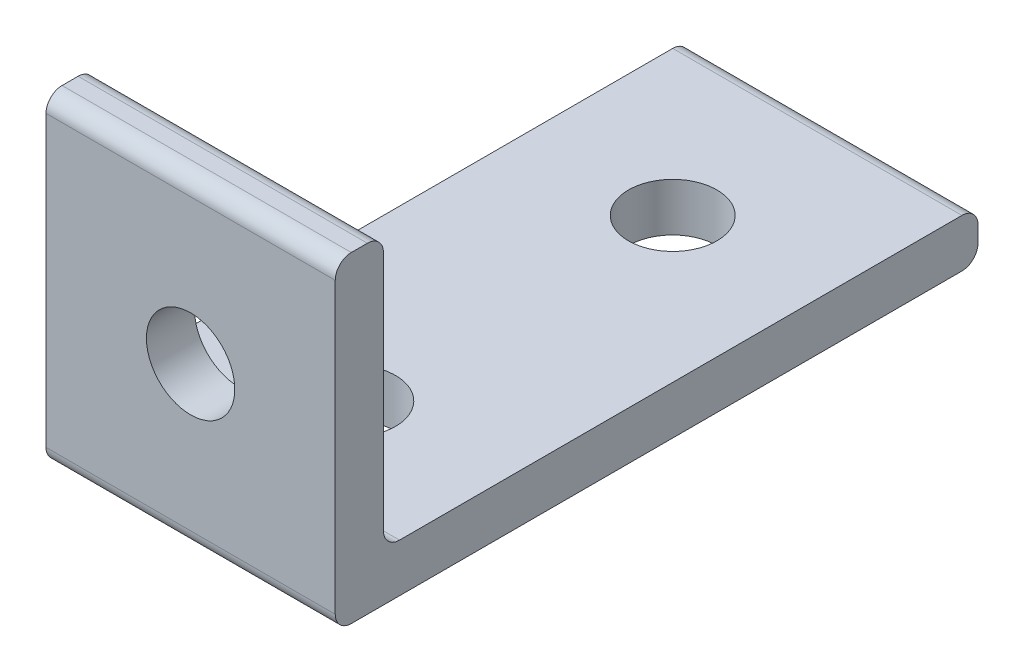
ISO-10303-21;
HEADER;
FILE_DESCRIPTION(('STEP AP214'),'2;1');
FILE_NAME('part.step','',(''),(''),'','','');
FILE_SCHEMA(('AUTOMOTIVE_DESIGN { 1 0 10303 214 1 1 1 1 }'));
ENDSEC;
DATA;
#1=APPLICATION_CONTEXT('core data for automotive mechanical design processes');
#2=APPLICATION_PROTOCOL_DEFINITION('international standard','automotive_design',2000,#1);
#3=PRODUCT_CONTEXT('',#1,'mechanical');
#4=PRODUCT('Part','Part','',(#3));
#5=PRODUCT_RELATED_PRODUCT_CATEGORY('part','',(#4));
#6=PRODUCT_DEFINITION_FORMATION('','',#4);
#7=PRODUCT_DEFINITION_CONTEXT('part definition',#1,'design');
#8=PRODUCT_DEFINITION('design','',#6,#7);
#9=PRODUCT_DEFINITION_SHAPE('','',#8);
#10=(LENGTH_UNIT() NAMED_UNIT(*) SI_UNIT(.MILLI.,.METRE.));
#11=(NAMED_UNIT(*) PLANE_ANGLE_UNIT() SI_UNIT($,.RADIAN.));
#12=(NAMED_UNIT(*) SI_UNIT($,.STERADIAN.) SOLID_ANGLE_UNIT());
#13=UNCERTAINTY_MEASURE_WITH_UNIT(LENGTH_MEASURE(1.E-05),#10,'distance_accuracy_value','');
#14=(GEOMETRIC_REPRESENTATION_CONTEXT(3) GLOBAL_UNCERTAINTY_ASSIGNED_CONTEXT((#13)) GLOBAL_UNIT_ASSIGNED_CONTEXT((#10,
#11,#12)) REPRESENTATION_CONTEXT('',''));
#15=CARTESIAN_POINT('',(0.,0.,0.));
#16=DIRECTION('',(0.,0.,1.));
#17=DIRECTION('',(1.,0.,0.));
#18=AXIS2_PLACEMENT_3D('',#15,#16,#17);
#19=CARTESIAN_POINT('',(18.,0.,0.));
#20=DIRECTION('',(0.,0.,-1.));
#21=DIRECTION('',(-1.,0.,0.));
#22=AXIS2_PLACEMENT_3D('',#19,#20,#21);
#23=PLANE('',#22);
#24=CARTESIAN_POINT('',(9.,10.,0.));
#25=DIRECTION('',(0.,0.,-1.));
#26=DIRECTION('',(-1.,0.,0.));
#27=AXIS2_PLACEMENT_3D('',#24,#25,#26);
#28=CIRCLE('',#27,2.75);
#29=CARTESIAN_POINT('',(6.25,10.,0.));
#30=VERTEX_POINT('',#29);
#31=EDGE_CURVE('E251',#30,#30,#28,.T.);
#32=ORIENTED_EDGE('',*,*,#31,.T.);
#33=EDGE_LOOP('',(#32));
#34=FACE_BOUND('',#33,.T.);
#35=DIRECTION('',(0.,-1.,0.));
#36=VECTOR('',#35,1.);
#37=CARTESIAN_POINT('',(0.,0.,0.));
#38=LINE('',#37,#36);
#39=CARTESIAN_POINT('',(0.,19.,0.));
#40=VERTEX_POINT('',#39);
#41=CARTESIAN_POINT('',(0.,1.,0.));
#42=VERTEX_POINT('',#41);
#43=EDGE_CURVE('E172',#40,#42,#38,.T.);
#44=ORIENTED_EDGE('',*,*,#43,.T.);
#45=DIRECTION('',(-1.,0.,0.));
#46=VECTOR('',#45,1.);
#47=CARTESIAN_POINT('',(18.,1.,0.));
#48=LINE('',#47,#46);
#49=CARTESIAN_POINT('',(18.,1.,0.));
#50=VERTEX_POINT('',#49);
#51=EDGE_CURVE('E58',#42,#50,#48,.F.);
#52=ORIENTED_EDGE('',*,*,#51,.T.);
#53=DIRECTION('',(0.,-1.,0.));
#54=VECTOR('',#53,1.);
#55=CARTESIAN_POINT('',(18.,0.,0.));
#56=LINE('',#55,#54);
#57=CARTESIAN_POINT('',(18.,19.,0.));
#58=VERTEX_POINT('',#57);
#59=EDGE_CURVE('E170',#58,#50,#56,.T.);
#60=ORIENTED_EDGE('',*,*,#59,.F.);
#61=DIRECTION('',(-1.,0.,0.));
#62=VECTOR('',#61,1.);
#63=CARTESIAN_POINT('',(18.,19.,0.));
#64=LINE('',#63,#62);
#65=EDGE_CURVE('E215',#58,#40,#64,.T.);
#66=ORIENTED_EDGE('',*,*,#65,.T.);
#67=EDGE_LOOP('',(#44,#52,#60,#66));
#68=FACE_BOUND('',#67,.T.);
#69=ADVANCED_FACE('F42',(#34,#68),#23,.F.);
#70=CARTESIAN_POINT('',(18.,0.,0.));
#71=DIRECTION('',(0.,1.,0.));
#72=DIRECTION('',(0.,0.,1.));
#73=AXIS2_PLACEMENT_3D('',#70,#71,#72);
#74=PLANE('',#73);
#75=CARTESIAN_POINT('',(9.,0.,-30.));
#76=DIRECTION('',(0.,1.,0.));
#77=DIRECTION('',(0.,0.,1.));
#78=AXIS2_PLACEMENT_3D('',#75,#76,#77);
#79=CIRCLE('',#78,2.75);
#80=CARTESIAN_POINT('',(9.,0.,-27.25));
#81=VERTEX_POINT('',#80);
#82=EDGE_CURVE('E347',#81,#81,#79,.T.);
#83=ORIENTED_EDGE('',*,*,#82,.T.);
#84=EDGE_LOOP('',(#83));
#85=FACE_BOUND('',#84,.T.);
#86=CARTESIAN_POINT('',(9.,0.,-10.));
#87=DIRECTION('',(0.,1.,0.));
#88=DIRECTION('',(0.,0.,1.));
#89=AXIS2_PLACEMENT_3D('',#86,#87,#88);
#90=CIRCLE('',#89,2.75);
#91=CARTESIAN_POINT('',(9.,0.,-7.25));
#92=VERTEX_POINT('',#91);
#93=EDGE_CURVE('E350',#92,#92,#90,.T.);
#94=ORIENTED_EDGE('',*,*,#93,.T.);
#95=EDGE_LOOP('',(#94));
#96=FACE_BOUND('',#95,.T.);
#97=DIRECTION('',(0.,0.,-1.));
#98=VECTOR('',#97,1.);
#99=CARTESIAN_POINT('',(0.,0.,0.));
#100=LINE('',#99,#98);
#101=CARTESIAN_POINT('',(0.,0.,-1.));
#102=VERTEX_POINT('',#101);
#103=CARTESIAN_POINT('',(0.,0.,-39.));
#104=VERTEX_POINT('',#103);
#105=EDGE_CURVE('E165',#102,#104,#100,.T.);
#106=ORIENTED_EDGE('',*,*,#105,.T.);
#107=DIRECTION('',(-1.,0.,0.));
#108=VECTOR('',#107,1.);
#109=CARTESIAN_POINT('',(18.,0.,-39.));
#110=LINE('',#109,#108);
#111=CARTESIAN_POINT('',(18.,0.,-39.));
#112=VERTEX_POINT('',#111);
#113=EDGE_CURVE('E138',#104,#112,#110,.F.);
#114=ORIENTED_EDGE('',*,*,#113,.T.);
#115=DIRECTION('',(0.,0.,-1.));
#116=VECTOR('',#115,1.);
#117=CARTESIAN_POINT('',(18.,0.,0.));
#118=LINE('',#117,#116);
#119=CARTESIAN_POINT('',(18.,0.,-1.));
#120=VERTEX_POINT('',#119);
#121=EDGE_CURVE('E271',#120,#112,#118,.T.);
#122=ORIENTED_EDGE('',*,*,#121,.F.);
#123=DIRECTION('',(-1.,0.,0.));
#124=VECTOR('',#123,1.);
#125=CARTESIAN_POINT('',(18.,0.,-1.));
#126=LINE('',#125,#124);
#127=EDGE_CURVE('E144',#120,#102,#126,.T.);
#128=ORIENTED_EDGE('',*,*,#127,.T.);
#129=EDGE_LOOP('',(#106,#114,#122,#128));
#130=FACE_BOUND('',#129,.T.);
#131=ADVANCED_FACE('F292',(#85,#96,#130),#74,.F.);
#132=CARTESIAN_POINT('',(18.,0.,-40.));
#133=DIRECTION('',(0.,0.,1.));
#134=DIRECTION('',(1.,0.,0.));
#135=AXIS2_PLACEMENT_3D('',#132,#133,#134);
#136=PLANE('',#135);
#137=DIRECTION('',(0.,1.,0.));
#138=VECTOR('',#137,1.);
#139=CARTESIAN_POINT('',(18.,0.,-40.));
#140=LINE('',#139,#138);
#141=CARTESIAN_POINT('',(18.,1.,-40.));
#142=VERTEX_POINT('',#141);
#143=CARTESIAN_POINT('',(18.,2.,-40.));
#144=VERTEX_POINT('',#143);
#145=EDGE_CURVE('E155',#142,#144,#140,.T.);
#146=ORIENTED_EDGE('',*,*,#145,.F.);
#147=DIRECTION('',(-1.,0.,0.));
#148=VECTOR('',#147,1.);
#149=CARTESIAN_POINT('',(18.,1.,-40.));
#150=LINE('',#149,#148);
#151=CARTESIAN_POINT('',(0.,1.,-40.));
#152=VERTEX_POINT('',#151);
#153=EDGE_CURVE('E137',#142,#152,#150,.T.);
#154=ORIENTED_EDGE('',*,*,#153,.T.);
#155=DIRECTION('',(0.,1.,0.));
#156=VECTOR('',#155,1.);
#157=CARTESIAN_POINT('',(0.,0.,-40.));
#158=LINE('',#157,#156);
#159=CARTESIAN_POINT('',(0.,2.,-40.));
#160=VERTEX_POINT('',#159);
#161=EDGE_CURVE('E152',#152,#160,#158,.T.);
#162=ORIENTED_EDGE('',*,*,#161,.T.);
#163=DIRECTION('',(1.,0.,0.));
#164=VECTOR('',#163,1.);
#165=CARTESIAN_POINT('',(18.,2.,-40.));
#166=LINE('',#165,#164);
#167=EDGE_CURVE('E158',#160,#144,#166,.T.);
#168=ORIENTED_EDGE('',*,*,#167,.T.);
#169=EDGE_LOOP('',(#146,#154,#162,#168));
#170=FACE_BOUND('',#169,.T.);
#171=ADVANCED_FACE('F150',(#170),#136,.F.);
#172=CARTESIAN_POINT('',(18.,20.,0.));
#173=DIRECTION('',(0.,-1.,0.));
#174=DIRECTION('',(0.,0.,-1.));
#175=AXIS2_PLACEMENT_3D('',#172,#173,#174);
#176=PLANE('',#175);
#177=DIRECTION('',(0.,0.,1.));
#178=VECTOR('',#177,1.);
#179=CARTESIAN_POINT('',(0.,20.,0.));
#180=LINE('',#179,#178);
#181=CARTESIAN_POINT('',(0.,20.,-2.));
#182=VERTEX_POINT('',#181);
#183=CARTESIAN_POINT('',(0.,20.,-1.));
#184=VERTEX_POINT('',#183);
#185=EDGE_CURVE('E164',#182,#184,#180,.T.);
#186=ORIENTED_EDGE('',*,*,#185,.T.);
#187=DIRECTION('',(-1.,0.,0.));
#188=VECTOR('',#187,1.);
#189=CARTESIAN_POINT('',(18.,20.,-1.));
#190=LINE('',#189,#188);
#191=CARTESIAN_POINT('',(18.,20.,-1.));
#192=VERTEX_POINT('',#191);
#193=EDGE_CURVE('E224',#184,#192,#190,.F.);
#194=ORIENTED_EDGE('',*,*,#193,.T.);
#195=DIRECTION('',(0.,0.,1.));
#196=VECTOR('',#195,1.);
#197=CARTESIAN_POINT('',(18.,20.,0.));
#198=LINE('',#197,#196);
#199=CARTESIAN_POINT('',(18.,20.,-2.));
#200=VERTEX_POINT('',#199);
#201=EDGE_CURVE('E177',#200,#192,#198,.T.);
#202=ORIENTED_EDGE('',*,*,#201,.F.);
#203=DIRECTION('',(1.,0.,0.));
#204=VECTOR('',#203,1.);
#205=CARTESIAN_POINT('',(18.,20.,-2.));
#206=LINE('',#205,#204);
#207=EDGE_CURVE('E221',#200,#182,#206,.F.);
#208=ORIENTED_EDGE('',*,*,#207,.T.);
#209=EDGE_LOOP('',(#186,#194,#202,#208));
#210=FACE_BOUND('',#209,.T.);
#211=ADVANCED_FACE('F316',(#210),#176,.F.);
#212=CARTESIAN_POINT('',(18.,0.,0.));
#213=DIRECTION('',(-1.,0.,0.));
#214=DIRECTION('',(0.,0.,1.));
#215=AXIS2_PLACEMENT_3D('',#212,#213,#214);
#216=PLANE('',#215);
#217=ORIENTED_EDGE('',*,*,#121,.T.);
#218=CARTESIAN_POINT('',(18.,1.,-39.));
#219=DIRECTION('',(-1.,0.,0.));
#220=DIRECTION('',(0.,0.,1.));
#221=AXIS2_PLACEMENT_3D('',#218,#219,#220);
#222=CIRCLE('',#221,1.);
#223=EDGE_CURVE('E205',#112,#142,#222,.F.);
#224=ORIENTED_EDGE('',*,*,#223,.T.);
#225=ORIENTED_EDGE('',*,*,#145,.T.);
#226=CARTESIAN_POINT('',(18.,2.,-39.));
#227=DIRECTION('',(-1.,0.,0.));
#228=DIRECTION('',(0.,0.,1.));
#229=AXIS2_PLACEMENT_3D('',#226,#227,#228);
#230=CIRCLE('',#229,1.);
#231=CARTESIAN_POINT('',(18.,3.,-39.));
#232=VERTEX_POINT('',#231);
#233=EDGE_CURVE('E202',#144,#232,#230,.F.);
#234=ORIENTED_EDGE('',*,*,#233,.T.);
#235=DIRECTION('',(0.,0.,-1.));
#236=VECTOR('',#235,1.);
#237=CARTESIAN_POINT('',(18.,3.,-3.));
#238=LINE('',#237,#236);
#239=CARTESIAN_POINT('',(18.,3.,-4.));
#240=VERTEX_POINT('',#239);
#241=EDGE_CURVE('E241',#240,#232,#238,.T.);
#242=ORIENTED_EDGE('',*,*,#241,.F.);
#243=CARTESIAN_POINT('',(18.,4.,-4.));
#244=DIRECTION('',(-1.,0.,0.));
#245=DIRECTION('',(0.,0.,1.));
#246=AXIS2_PLACEMENT_3D('',#243,#244,#245);
#247=CIRCLE('',#246,1.);
#248=CARTESIAN_POINT('',(18.,4.,-3.));
#249=VERTEX_POINT('',#248);
#250=EDGE_CURVE('E51',#240,#249,#247,.T.);
#251=ORIENTED_EDGE('',*,*,#250,.T.);
#252=DIRECTION('',(0.,-1.,0.));
#253=VECTOR('',#252,1.);
#254=CARTESIAN_POINT('',(18.,20.,-3.));
#255=LINE('',#254,#253);
#256=CARTESIAN_POINT('',(18.,19.,-3.));
#257=VERTEX_POINT('',#256);
#258=EDGE_CURVE('E239',#257,#249,#255,.T.);
#259=ORIENTED_EDGE('',*,*,#258,.F.);
#260=CARTESIAN_POINT('',(18.,19.,-2.));
#261=DIRECTION('',(-1.,0.,0.));
#262=DIRECTION('',(0.,0.,1.));
#263=AXIS2_PLACEMENT_3D('',#260,#261,#262);
#264=CIRCLE('',#263,1.);
#265=EDGE_CURVE('E194',#257,#200,#264,.F.);
#266=ORIENTED_EDGE('',*,*,#265,.T.);
#267=ORIENTED_EDGE('',*,*,#201,.T.);
#268=CARTESIAN_POINT('',(18.,19.,-1.));
#269=DIRECTION('',(-1.,0.,0.));
#270=DIRECTION('',(0.,0.,1.));
#271=AXIS2_PLACEMENT_3D('',#268,#269,#270);
#272=CIRCLE('',#271,1.);
#273=EDGE_CURVE('E65',#192,#58,#272,.F.);
#274=ORIENTED_EDGE('',*,*,#273,.T.);
#275=ORIENTED_EDGE('',*,*,#59,.T.);
#276=CARTESIAN_POINT('',(18.,1.,-1.));
#277=DIRECTION('',(-1.,0.,0.));
#278=DIRECTION('',(0.,0.,1.));
#279=AXIS2_PLACEMENT_3D('',#276,#277,#278);
#280=CIRCLE('',#279,1.);
#281=EDGE_CURVE('E199',#50,#120,#280,.F.);
#282=ORIENTED_EDGE('',*,*,#281,.T.);
#283=EDGE_LOOP('',(#217,#224,#225,#234,#242,#251,#259,#266,#267,#274,#275,#282));
#284=FACE_BOUND('',#283,.T.);
#285=ADVANCED_FACE('F238',(#284),#216,.F.);
#286=CARTESIAN_POINT('',(0.,0.,0.));
#287=DIRECTION('',(-1.,0.,0.));
#288=DIRECTION('',(0.,0.,1.));
#289=AXIS2_PLACEMENT_3D('',#286,#287,#288);
#290=PLANE('',#289);
#291=ORIENTED_EDGE('',*,*,#161,.F.);
#292=CARTESIAN_POINT('',(0.,1.,-39.));
#293=DIRECTION('',(-1.,0.,0.));
#294=DIRECTION('',(0.,0.,1.));
#295=AXIS2_PLACEMENT_3D('',#292,#293,#294);
#296=CIRCLE('',#295,1.);
#297=EDGE_CURVE('E133',#152,#104,#296,.T.);
#298=ORIENTED_EDGE('',*,*,#297,.T.);
#299=ORIENTED_EDGE('',*,*,#105,.F.);
#300=CARTESIAN_POINT('',(0.,1.,-1.));
#301=DIRECTION('',(-1.,0.,0.));
#302=DIRECTION('',(0.,0.,1.));
#303=AXIS2_PLACEMENT_3D('',#300,#301,#302);
#304=CIRCLE('',#303,1.);
#305=EDGE_CURVE('E184',#102,#42,#304,.T.);
#306=ORIENTED_EDGE('',*,*,#305,.T.);
#307=ORIENTED_EDGE('',*,*,#43,.F.);
#308=CARTESIAN_POINT('',(0.,19.,-1.));
#309=DIRECTION('',(-1.,0.,0.));
#310=DIRECTION('',(0.,0.,1.));
#311=AXIS2_PLACEMENT_3D('',#308,#309,#310);
#312=CIRCLE('',#311,1.);
#313=EDGE_CURVE('E181',#40,#184,#312,.T.);
#314=ORIENTED_EDGE('',*,*,#313,.T.);
#315=ORIENTED_EDGE('',*,*,#185,.F.);
#316=CARTESIAN_POINT('',(0.,19.,-2.));
#317=DIRECTION('',(-1.,0.,0.));
#318=DIRECTION('',(0.,0.,1.));
#319=AXIS2_PLACEMENT_3D('',#316,#317,#318);
#320=CIRCLE('',#319,1.);
#321=CARTESIAN_POINT('',(0.,19.,-3.));
#322=VERTEX_POINT('',#321);
#323=EDGE_CURVE('E157',#182,#322,#320,.T.);
#324=ORIENTED_EDGE('',*,*,#323,.T.);
#325=DIRECTION('',(0.,-1.,0.));
#326=VECTOR('',#325,1.);
#327=CARTESIAN_POINT('',(0.,20.,-3.));
#328=LINE('',#327,#326);
#329=CARTESIAN_POINT('',(0.,4.,-3.));
#330=VERTEX_POINT('',#329);
#331=EDGE_CURVE('E256',#322,#330,#328,.T.);
#332=ORIENTED_EDGE('',*,*,#331,.T.);
#333=CARTESIAN_POINT('',(0.,4.,-4.));
#334=DIRECTION('',(-1.,0.,0.));
#335=DIRECTION('',(0.,0.,1.));
#336=AXIS2_PLACEMENT_3D('',#333,#334,#335);
#337=CIRCLE('',#336,1.);
#338=CARTESIAN_POINT('',(0.,3.,-4.));
#339=VERTEX_POINT('',#338);
#340=EDGE_CURVE('E11',#330,#339,#337,.F.);
#341=ORIENTED_EDGE('',*,*,#340,.T.);
#342=DIRECTION('',(0.,0.,-1.));
#343=VECTOR('',#342,1.);
#344=CARTESIAN_POINT('',(0.,3.,-3.));
#345=LINE('',#344,#343);
#346=CARTESIAN_POINT('',(0.,3.,-39.));
#347=VERTEX_POINT('',#346);
#348=EDGE_CURVE('E255',#339,#347,#345,.T.);
#349=ORIENTED_EDGE('',*,*,#348,.T.);
#350=CARTESIAN_POINT('',(0.,2.,-39.));
#351=DIRECTION('',(-1.,0.,0.));
#352=DIRECTION('',(0.,0.,1.));
#353=AXIS2_PLACEMENT_3D('',#350,#351,#352);
#354=CIRCLE('',#353,1.);
#355=EDGE_CURVE('E145',#347,#160,#354,.T.);
#356=ORIENTED_EDGE('',*,*,#355,.T.);
#357=EDGE_LOOP('',(#291,#298,#299,#306,#307,#314,#315,#324,#332,#341,#349,#356));
#358=FACE_BOUND('',#357,.T.);
#359=ADVANCED_FACE('F160',(#358),#290,.T.);
#360=CARTESIAN_POINT('',(0.,3.,-3.));
#361=DIRECTION('',(0.,-1.,0.));
#362=DIRECTION('',(0.,0.,-1.));
#363=AXIS2_PLACEMENT_3D('',#360,#361,#362);
#364=PLANE('',#363);
#365=CARTESIAN_POINT('',(9.,3.,-30.));
#366=DIRECTION('',(0.,1.,0.));
#367=DIRECTION('',(0.,0.,1.));
#368=AXIS2_PLACEMENT_3D('',#365,#366,#367);
#369=CIRCLE('',#368,2.75);
#370=CARTESIAN_POINT('',(9.,3.,-27.25));
#371=VERTEX_POINT('',#370);
#372=EDGE_CURVE('E344',#371,#371,#369,.T.);
#373=ORIENTED_EDGE('',*,*,#372,.F.);
#374=EDGE_LOOP('',(#373));
#375=FACE_BOUND('',#374,.T.);
#376=CARTESIAN_POINT('',(9.,3.,-10.));
#377=DIRECTION('',(0.,1.,0.));
#378=DIRECTION('',(0.,0.,1.));
#379=AXIS2_PLACEMENT_3D('',#376,#377,#378);
#380=CIRCLE('',#379,2.75);
#381=CARTESIAN_POINT('',(9.,3.,-7.25));
#382=VERTEX_POINT('',#381);
#383=EDGE_CURVE('E362',#382,#382,#380,.T.);
#384=ORIENTED_EDGE('',*,*,#383,.F.);
#385=EDGE_LOOP('',(#384));
#386=FACE_BOUND('',#385,.T.);
#387=ORIENTED_EDGE('',*,*,#241,.T.);
#388=DIRECTION('',(1.,0.,0.));
#389=VECTOR('',#388,1.);
#390=CARTESIAN_POINT('',(0.,3.,-39.));
#391=LINE('',#390,#389);
#392=EDGE_CURVE('E212',#232,#347,#391,.F.);
#393=ORIENTED_EDGE('',*,*,#392,.T.);
#394=ORIENTED_EDGE('',*,*,#348,.F.);
#395=DIRECTION('',(1.,0.,0.));
#396=VECTOR('',#395,1.);
#397=CARTESIAN_POINT('',(18.,3.,-4.));
#398=LINE('',#397,#396);
#399=EDGE_CURVE('E208',#339,#240,#398,.T.);
#400=ORIENTED_EDGE('',*,*,#399,.T.);
#401=EDGE_LOOP('',(#387,#393,#394,#400));
#402=FACE_BOUND('',#401,.T.);
#403=ADVANCED_FACE('F258',(#375,#386,#402),#364,.F.);
#404=CARTESIAN_POINT('',(0.,20.,-3.));
#405=DIRECTION('',(0.,0.,1.));
#406=DIRECTION('',(1.,0.,0.));
#407=AXIS2_PLACEMENT_3D('',#404,#405,#406);
#408=PLANE('',#407);
#409=CARTESIAN_POINT('',(9.,10.,-3.));
#410=DIRECTION('',(0.,0.,-1.));
#411=DIRECTION('',(-1.,0.,0.));
#412=AXIS2_PLACEMENT_3D('',#409,#410,#411);
#413=CIRCLE('',#412,2.75);
#414=CARTESIAN_POINT('',(6.25,10.,-3.));
#415=VERTEX_POINT('',#414);
#416=EDGE_CURVE('E349',#415,#415,#413,.T.);
#417=ORIENTED_EDGE('',*,*,#416,.F.);
#418=EDGE_LOOP('',(#417));
#419=FACE_BOUND('',#418,.T.);
#420=ORIENTED_EDGE('',*,*,#331,.F.);
#421=DIRECTION('',(1.,0.,0.));
#422=VECTOR('',#421,1.);
#423=CARTESIAN_POINT('',(0.,19.,-3.));
#424=LINE('',#423,#422);
#425=EDGE_CURVE('E230',#322,#257,#424,.T.);
#426=ORIENTED_EDGE('',*,*,#425,.T.);
#427=ORIENTED_EDGE('',*,*,#258,.T.);
#428=DIRECTION('',(1.,0.,0.));
#429=VECTOR('',#428,1.);
#430=CARTESIAN_POINT('',(0.,4.,-3.));
#431=LINE('',#430,#429);
#432=EDGE_CURVE('E227',#249,#330,#431,.F.);
#433=ORIENTED_EDGE('',*,*,#432,.T.);
#434=EDGE_LOOP('',(#420,#426,#427,#433));
#435=FACE_BOUND('',#434,.T.);
#436=ADVANCED_FACE('F247',(#419,#435),#408,.F.);
#437=CARTESIAN_POINT('',(9.,10.,15.));
#438=DIRECTION('',(0.,0.,-1.));
#439=DIRECTION('',(-1.,0.,0.));
#440=AXIS2_PLACEMENT_3D('',#437,#438,#439);
#441=CYLINDRICAL_SURFACE('',#440,2.75);
#442=ORIENTED_EDGE('',*,*,#416,.T.);
#443=EDGE_LOOP('',(#442));
#444=FACE_BOUND('',#443,.T.);
#445=ORIENTED_EDGE('',*,*,#31,.F.);
#446=EDGE_LOOP('',(#445));
#447=FACE_BOUND('',#446,.T.);
#448=ADVANCED_FACE('F325',(#444,#447),#441,.F.);
#449=CARTESIAN_POINT('',(9.,-15.,-10.));
#450=DIRECTION('',(0.,1.,0.));
#451=DIRECTION('',(0.,0.,1.));
#452=AXIS2_PLACEMENT_3D('',#449,#450,#451);
#453=CYLINDRICAL_SURFACE('',#452,2.75);
#454=ORIENTED_EDGE('',*,*,#383,.T.);
#455=EDGE_LOOP('',(#454));
#456=FACE_BOUND('',#455,.T.);
#457=ORIENTED_EDGE('',*,*,#93,.F.);
#458=EDGE_LOOP('',(#457));
#459=FACE_BOUND('',#458,.T.);
#460=ADVANCED_FACE('F332',(#456,#459),#453,.F.);
#461=CARTESIAN_POINT('',(9.,-15.,-30.));
#462=DIRECTION('',(0.,1.,0.));
#463=DIRECTION('',(0.,0.,1.));
#464=AXIS2_PLACEMENT_3D('',#461,#462,#463);
#465=CYLINDRICAL_SURFACE('',#464,2.75);
#466=ORIENTED_EDGE('',*,*,#372,.T.);
#467=EDGE_LOOP('',(#466));
#468=FACE_BOUND('',#467,.T.);
#469=ORIENTED_EDGE('',*,*,#82,.F.);
#470=EDGE_LOOP('',(#469));
#471=FACE_BOUND('',#470,.T.);
#472=ADVANCED_FACE('F302',(#468,#471),#465,.F.);
#473=CARTESIAN_POINT('',(18.,1.,-39.));
#474=DIRECTION('',(-1.,0.,0.));
#475=DIRECTION('',(0.,0.,1.));
#476=AXIS2_PLACEMENT_3D('',#473,#474,#475);
#477=CYLINDRICAL_SURFACE('',#476,1.);
#478=ORIENTED_EDGE('',*,*,#223,.F.);
#479=ORIENTED_EDGE('',*,*,#113,.F.);
#480=ORIENTED_EDGE('',*,*,#297,.F.);
#481=ORIENTED_EDGE('',*,*,#153,.F.);
#482=EDGE_LOOP('',(#478,#479,#480,#481));
#483=FACE_BOUND('',#482,.T.);
#484=ADVANCED_FACE('F136',(#483),#477,.T.);
#485=CARTESIAN_POINT('',(18.,2.,-39.));
#486=DIRECTION('',(1.,0.,0.));
#487=DIRECTION('',(0.,0.,-1.));
#488=AXIS2_PLACEMENT_3D('',#485,#486,#487);
#489=CYLINDRICAL_SURFACE('',#488,1.);
#490=ORIENTED_EDGE('',*,*,#355,.F.);
#491=ORIENTED_EDGE('',*,*,#392,.F.);
#492=ORIENTED_EDGE('',*,*,#233,.F.);
#493=ORIENTED_EDGE('',*,*,#167,.F.);
#494=EDGE_LOOP('',(#490,#491,#492,#493));
#495=FACE_BOUND('',#494,.T.);
#496=ADVANCED_FACE('F294',(#495),#489,.T.);
#497=CARTESIAN_POINT('',(18.,1.,-1.));
#498=DIRECTION('',(-1.,0.,0.));
#499=DIRECTION('',(0.,0.,1.));
#500=AXIS2_PLACEMENT_3D('',#497,#498,#499);
#501=CYLINDRICAL_SURFACE('',#500,1.);
#502=ORIENTED_EDGE('',*,*,#281,.F.);
#503=ORIENTED_EDGE('',*,*,#51,.F.);
#504=ORIENTED_EDGE('',*,*,#305,.F.);
#505=ORIENTED_EDGE('',*,*,#127,.F.);
#506=EDGE_LOOP('',(#502,#503,#504,#505));
#507=FACE_BOUND('',#506,.T.);
#508=ADVANCED_FACE('F289',(#507),#501,.T.);
#509=CARTESIAN_POINT('',(18.,19.,-1.));
#510=DIRECTION('',(-1.,0.,0.));
#511=DIRECTION('',(0.,0.,1.));
#512=AXIS2_PLACEMENT_3D('',#509,#510,#511);
#513=CYLINDRICAL_SURFACE('',#512,1.);
#514=ORIENTED_EDGE('',*,*,#273,.F.);
#515=ORIENTED_EDGE('',*,*,#193,.F.);
#516=ORIENTED_EDGE('',*,*,#313,.F.);
#517=ORIENTED_EDGE('',*,*,#65,.F.);
#518=EDGE_LOOP('',(#514,#515,#516,#517));
#519=FACE_BOUND('',#518,.T.);
#520=ADVANCED_FACE('F283',(#519),#513,.T.);
#521=CARTESIAN_POINT('',(0.,19.,-2.));
#522=DIRECTION('',(1.,0.,0.));
#523=DIRECTION('',(0.,0.,-1.));
#524=AXIS2_PLACEMENT_3D('',#521,#522,#523);
#525=CYLINDRICAL_SURFACE('',#524,1.);
#526=ORIENTED_EDGE('',*,*,#323,.F.);
#527=ORIENTED_EDGE('',*,*,#207,.F.);
#528=ORIENTED_EDGE('',*,*,#265,.F.);
#529=ORIENTED_EDGE('',*,*,#425,.F.);
#530=EDGE_LOOP('',(#526,#527,#528,#529));
#531=FACE_BOUND('',#530,.T.);
#532=ADVANCED_FACE('F405',(#531),#525,.T.);
#533=CARTESIAN_POINT('',(0.,4.,-4.));
#534=DIRECTION('',(-1.,0.,0.));
#535=DIRECTION('',(0.,0.,1.));
#536=AXIS2_PLACEMENT_3D('',#533,#534,#535);
#537=CYLINDRICAL_SURFACE('',#536,1.);
#538=ORIENTED_EDGE('',*,*,#340,.F.);
#539=ORIENTED_EDGE('',*,*,#432,.F.);
#540=ORIENTED_EDGE('',*,*,#250,.F.);
#541=ORIENTED_EDGE('',*,*,#399,.F.);
#542=EDGE_LOOP('',(#538,#539,#540,#541));
#543=FACE_BOUND('',#542,.T.);
#544=ADVANCED_FACE('F44',(#543),#537,.F.);
#545=CLOSED_SHELL('',(#69,#131,#171,#211,#285,#359,#403,#436,#448,#460,#472,#484,#496,#508,#520,
#532,#544));
#546=MANIFOLD_SOLID_BREP('B2',#545);
#547=ADVANCED_BREP_SHAPE_REPRESENTATION('',(#18,#546),#14);
#548=SHAPE_DEFINITION_REPRESENTATION(#9,#547);
ENDSEC;
END-ISO-10303-21;
